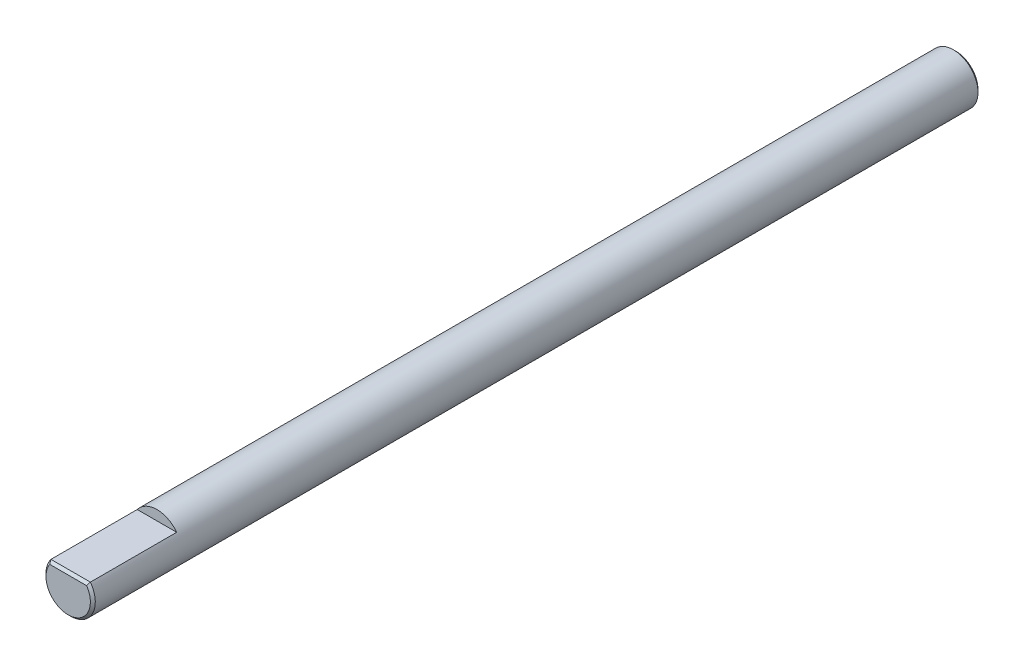
ISO-10303-21;
HEADER;
FILE_DESCRIPTION(('STEP AP214'),'2;1');
FILE_NAME('part.step','',(''),(''),'','','');
FILE_SCHEMA(('AUTOMOTIVE_DESIGN { 1 0 10303 214 1 1 1 1 }'));
ENDSEC;
DATA;
#1=APPLICATION_CONTEXT('core data for automotive mechanical design processes');
#2=APPLICATION_PROTOCOL_DEFINITION('international standard','automotive_design',2000,#1);
#3=PRODUCT_CONTEXT('',#1,'mechanical');
#4=PRODUCT('Part','Part','',(#3));
#5=PRODUCT_RELATED_PRODUCT_CATEGORY('part','',(#4));
#6=PRODUCT_DEFINITION_FORMATION('','',#4);
#7=PRODUCT_DEFINITION_CONTEXT('part definition',#1,'design');
#8=PRODUCT_DEFINITION('design','',#6,#7);
#9=PRODUCT_DEFINITION_SHAPE('','',#8);
#10=(LENGTH_UNIT() NAMED_UNIT(*) SI_UNIT(.MILLI.,.METRE.));
#11=(NAMED_UNIT(*) PLANE_ANGLE_UNIT() SI_UNIT($,.RADIAN.));
#12=(NAMED_UNIT(*) SI_UNIT($,.STERADIAN.) SOLID_ANGLE_UNIT());
#13=UNCERTAINTY_MEASURE_WITH_UNIT(LENGTH_MEASURE(1.E-05),#10,'distance_accuracy_value','');
#14=(GEOMETRIC_REPRESENTATION_CONTEXT(3) GLOBAL_UNCERTAINTY_ASSIGNED_CONTEXT((#13)) GLOBAL_UNIT_ASSIGNED_CONTEXT((#10,
#11,#12)) REPRESENTATION_CONTEXT('',''));
#15=CARTESIAN_POINT('',(0.,0.,0.));
#16=DIRECTION('',(0.,0.,1.));
#17=DIRECTION('',(1.,0.,0.));
#18=AXIS2_PLACEMENT_3D('',#15,#16,#17);
#19=CARTESIAN_POINT('',(0.,0.,90.));
#20=DIRECTION('',(0.,0.,-1.));
#21=DIRECTION('',(-1.,0.,0.));
#22=AXIS2_PLACEMENT_3D('',#19,#20,#21);
#23=CYLINDRICAL_SURFACE('',#22,2.5);
#24=CARTESIAN_POINT('',(0.,0.,0.250000000000056));
#25=DIRECTION('',(0.,0.,1.));
#26=DIRECTION('',(1.,0.,0.));
#27=AXIS2_PLACEMENT_3D('',#24,#25,#26);
#28=CIRCLE('',#27,2.5);
#29=CARTESIAN_POINT('',(2.5,0.,0.250000000000056));
#30=VERTEX_POINT('',#29);
#31=EDGE_CURVE('E112',#30,#30,#28,.T.);
#32=ORIENTED_EDGE('',*,*,#31,.T.);
#33=EDGE_LOOP('',(#32));
#34=FACE_BOUND('',#33,.T.);
#35=DIRECTION('',(0.,0.,-1.));
#36=VECTOR('',#35,1.);
#37=CARTESIAN_POINT('',(2.,1.5,90.));
#38=LINE('',#37,#36);
#39=CARTESIAN_POINT('',(2.,1.5,81.));
#40=VERTEX_POINT('',#39);
#41=CARTESIAN_POINT('',(2.,1.5,89.75));
#42=VERTEX_POINT('',#41);
#43=EDGE_CURVE('E95',#40,#42,#38,.F.);
#44=ORIENTED_EDGE('',*,*,#43,.T.);
#45=CARTESIAN_POINT('',(0.,0.,89.75));
#46=DIRECTION('',(0.,0.,1.));
#47=DIRECTION('',(1.,0.,0.));
#48=AXIS2_PLACEMENT_3D('',#45,#46,#47);
#49=CIRCLE('',#48,2.5);
#50=CARTESIAN_POINT('',(-2.,1.5,89.75));
#51=VERTEX_POINT('',#50);
#52=EDGE_CURVE('E91',#42,#51,#49,.F.);
#53=ORIENTED_EDGE('',*,*,#52,.T.);
#54=DIRECTION('',(0.,0.,-1.));
#55=VECTOR('',#54,1.);
#56=CARTESIAN_POINT('',(-2.,1.5,90.));
#57=LINE('',#56,#55);
#58=CARTESIAN_POINT('',(-2.,1.5,81.));
#59=VERTEX_POINT('',#58);
#60=EDGE_CURVE('E87',#51,#59,#57,.T.);
#61=ORIENTED_EDGE('',*,*,#60,.T.);
#62=CARTESIAN_POINT('',(0.,0.,81.));
#63=DIRECTION('',(0.,0.,-1.));
#64=DIRECTION('',(-1.,0.,0.));
#65=AXIS2_PLACEMENT_3D('',#62,#63,#64);
#66=CIRCLE('',#65,2.5);
#67=EDGE_CURVE('E90',#59,#40,#66,.T.);
#68=ORIENTED_EDGE('',*,*,#67,.T.);
#69=EDGE_LOOP('',(#44,#53,#61,#68));
#70=FACE_BOUND('',#69,.T.);
#71=ADVANCED_FACE('F41',(#34,#70),#23,.T.);
#72=CARTESIAN_POINT('',(0.,0.,90.));
#73=DIRECTION('',(0.,0.,1.));
#74=DIRECTION('',(1.,0.,0.));
#75=AXIS2_PLACEMENT_3D('',#72,#73,#74);
#76=PLANE('',#75);
#77=DIRECTION('',(-1.,0.,0.));
#78=VECTOR('',#77,1.);
#79=CARTESIAN_POINT('',(-2.,1.24999999999999,90.));
#80=LINE('',#79,#78);
#81=CARTESIAN_POINT('',(1.87082869338702,1.24999999999999,90.));
#82=VERTEX_POINT('',#81);
#83=CARTESIAN_POINT('',(-1.87082869338702,1.24999999999999,90.));
#84=VERTEX_POINT('',#83);
#85=EDGE_CURVE('E64',#82,#84,#80,.T.);
#86=ORIENTED_EDGE('',*,*,#85,.T.);
#87=CARTESIAN_POINT('',(0.,0.,90.));
#88=DIRECTION('',(0.,0.,1.));
#89=DIRECTION('',(1.,0.,0.));
#90=AXIS2_PLACEMENT_3D('',#87,#88,#89);
#91=CIRCLE('',#90,2.24999999999999);
#92=EDGE_CURVE('E57',#84,#82,#91,.T.);
#93=ORIENTED_EDGE('',*,*,#92,.T.);
#94=EDGE_LOOP('',(#86,#93));
#95=FACE_BOUND('',#94,.T.);
#96=ADVANCED_FACE('F146',(#95),#76,.T.);
#97=CARTESIAN_POINT('',(0.,0.,0.));
#98=DIRECTION('',(0.,0.,1.));
#99=DIRECTION('',(1.,0.,0.));
#100=AXIS2_PLACEMENT_3D('',#97,#98,#99);
#101=PLANE('',#100);
#102=CARTESIAN_POINT('',(0.,0.,0.));
#103=DIRECTION('',(0.,0.,1.));
#104=DIRECTION('',(1.,0.,0.));
#105=AXIS2_PLACEMENT_3D('',#102,#103,#104);
#106=CIRCLE('',#105,2.24999999999994);
#107=CARTESIAN_POINT('',(2.24999999999994,0.,0.));
#108=VERTEX_POINT('',#107);
#109=EDGE_CURVE('E116',#108,#108,#106,.F.);
#110=ORIENTED_EDGE('',*,*,#109,.T.);
#111=EDGE_LOOP('',(#110));
#112=FACE_BOUND('',#111,.T.);
#113=ADVANCED_FACE('F148',(#112),#101,.F.);
#114=CARTESIAN_POINT('',(-0.151158950199471,2.02857878289165,81.));
#115=DIRECTION('',(0.,0.,-1.));
#116=DIRECTION('',(-1.,0.,0.));
#117=AXIS2_PLACEMENT_3D('',#114,#115,#116);
#118=PLANE('',#117);
#119=DIRECTION('',(1.,0.,0.));
#120=VECTOR('',#119,1.);
#121=CARTESIAN_POINT('',(-2.45411001500319,1.5,81.));
#122=LINE('',#121,#120);
#123=EDGE_CURVE('E100',#59,#40,#122,.T.);
#124=ORIENTED_EDGE('',*,*,#123,.T.);
#125=ORIENTED_EDGE('',*,*,#67,.F.);
#126=EDGE_LOOP('',(#124,#125));
#127=FACE_BOUND('',#126,.T.);
#128=ADVANCED_FACE('F99',(#127),#118,.F.);
#129=CARTESIAN_POINT('',(-2.45411001500319,1.5,81.));
#130=DIRECTION('',(0.,-1.,0.));
#131=DIRECTION('',(0.,0.,-1.));
#132=AXIS2_PLACEMENT_3D('',#129,#130,#131);
#133=PLANE('',#132);
#134=ORIENTED_EDGE('',*,*,#60,.F.);
#135=DIRECTION('',(1.,0.,0.));
#136=VECTOR('',#135,1.);
#137=CARTESIAN_POINT('',(2.,1.5,89.75));
#138=LINE('',#137,#136);
#139=EDGE_CURVE('E11',#51,#42,#138,.T.);
#140=ORIENTED_EDGE('',*,*,#139,.T.);
#141=ORIENTED_EDGE('',*,*,#43,.F.);
#142=ORIENTED_EDGE('',*,*,#123,.F.);
#143=EDGE_LOOP('',(#134,#140,#141,#142));
#144=FACE_BOUND('',#143,.T.);
#145=ADVANCED_FACE('F103',(#144),#133,.F.);
#146=CARTESIAN_POINT('',(0.,0.,0.250000000000056));
#147=DIRECTION('',(0.,0.,1.));
#148=DIRECTION('',(1.,0.,0.));
#149=AXIS2_PLACEMENT_3D('',#146,#147,#148);
#150=CONICAL_SURFACE('',#149,2.5,0.785398163397459);
#151=ORIENTED_EDGE('',*,*,#109,.F.);
#152=EDGE_LOOP('',(#151));
#153=FACE_BOUND('',#152,.T.);
#154=ORIENTED_EDGE('',*,*,#31,.F.);
#155=EDGE_LOOP('',(#154));
#156=FACE_BOUND('',#155,.T.);
#157=ADVANCED_FACE('F135',(#153,#156),#150,.T.);
#158=CARTESIAN_POINT('',(-2.45411001500319,1.5,89.75));
#159=DIRECTION('',(0.,0.707106781186548,0.707106781186548));
#160=DIRECTION('',(-1.,0.,0.));
#161=AXIS2_PLACEMENT_3D('',#158,#159,#160);
#162=PLANE('',#161);
#163=CARTESIAN_POINT('',(1.87082869338702,1.24999999999991,90.));
#164=CARTESIAN_POINT('',(1.89299095568164,1.29150302396899,89.9584969760309));
#165=CARTESIAN_POINT('',(1.91483637828597,1.33308790112954,89.9169120988704));
#166=CARTESIAN_POINT('',(1.95789347856104,1.41642123496132,89.8335787650387));
#167=CARTESIAN_POINT('',(1.97910515816127,1.45816969113406,89.7918303088659));
#168=CARTESIAN_POINT('',(2.00000000000072,1.49999999999981,89.7500000000002));
#169=B_SPLINE_CURVE_WITH_KNOTS('',3,(#163,#164,#165,#166,#167,#168),.UNSPECIFIED.,.F.,.F.,(4,2,
4),(0.,0.188208497552832,0.376416422023878),.UNSPECIFIED.);
#170=EDGE_CURVE('E72',#42,#82,#169,.F.);
#171=ORIENTED_EDGE('',*,*,#170,.F.);
#172=ORIENTED_EDGE('',*,*,#139,.F.);
#173=CARTESIAN_POINT('',(-2.,1.5,89.75));
#174=CARTESIAN_POINT('',(-1.97910515816084,1.45816969113417,89.7918303088658));
#175=CARTESIAN_POINT('',(-1.95789347856085,1.41642123496137,89.8335787650386));
#176=CARTESIAN_POINT('',(-1.91483637828617,1.33308790112951,89.9169120988705));
#177=CARTESIAN_POINT('',(-1.89299095568197,1.29150302396893,89.958496976031));
#178=CARTESIAN_POINT('',(-1.87082869338744,1.24999999999984,90.0000000000001));
#179=B_SPLINE_CURVE_WITH_KNOTS('',3,(#173,#174,#175,#176,#177,#178),.UNSPECIFIED.,.F.,.F.,(4,2,
4),(0.,0.188207924471043,0.376416422023881),.UNSPECIFIED.);
#180=EDGE_CURVE('E47',#84,#51,#179,.F.);
#181=ORIENTED_EDGE('',*,*,#180,.F.);
#182=ORIENTED_EDGE('',*,*,#85,.F.);
#183=EDGE_LOOP('',(#171,#172,#181,#182));
#184=FACE_BOUND('',#183,.T.);
#185=ADVANCED_FACE('F129',(#184),#162,.T.);
#186=CARTESIAN_POINT('',(0.,0.,90.));
#187=DIRECTION('',(0.,0.,-1.));
#188=DIRECTION('',(-1.,0.,0.));
#189=AXIS2_PLACEMENT_3D('',#186,#187,#188);
#190=CONICAL_SURFACE('',#189,2.24999999999999,0.785398163397448);
#191=ORIENTED_EDGE('',*,*,#180,.T.);
#192=ORIENTED_EDGE('',*,*,#52,.F.);
#193=ORIENTED_EDGE('',*,*,#170,.T.);
#194=ORIENTED_EDGE('',*,*,#92,.F.);
#195=EDGE_LOOP('',(#191,#192,#193,#194));
#196=FACE_BOUND('',#195,.T.);
#197=ADVANCED_FACE('F44',(#196),#190,.T.);
#198=CLOSED_SHELL('',(#71,#96,#113,#128,#145,#157,#185,#197));
#199=MANIFOLD_SOLID_BREP('B2',#198);
#200=ADVANCED_BREP_SHAPE_REPRESENTATION('',(#18,#199),#14);
#201=SHAPE_DEFINITION_REPRESENTATION(#9,#200);
ENDSEC;
END-ISO-10303-21;
